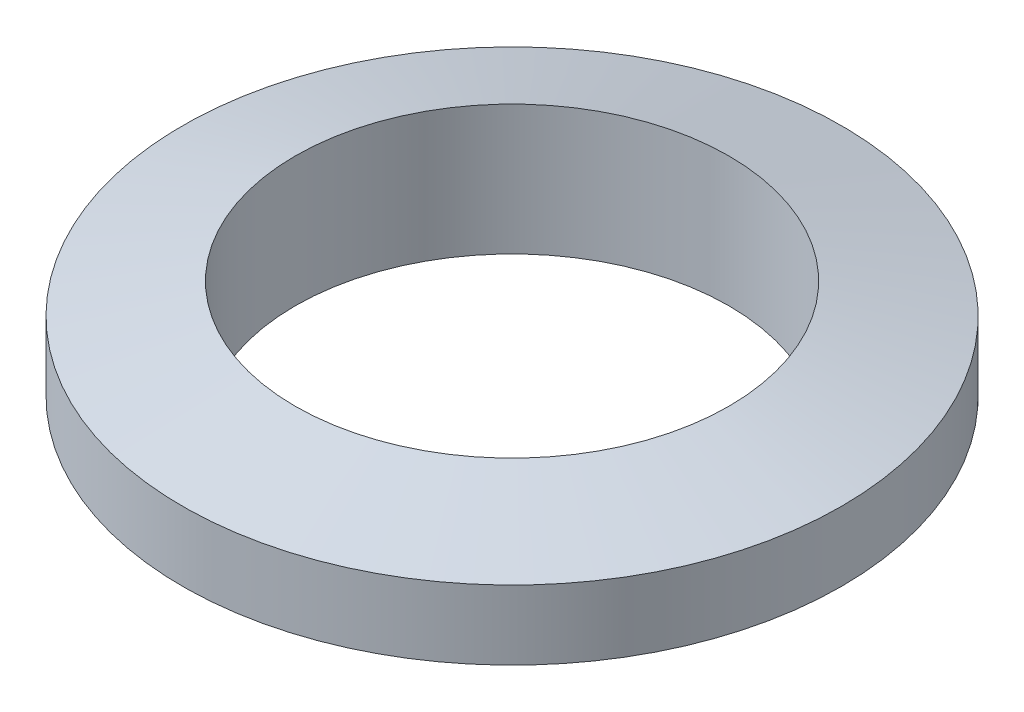
ISO-10303-21;
HEADER;
FILE_DESCRIPTION(('STEP AP214'),'2;1');
FILE_NAME('part.step','',(''),(''),'','','');
FILE_SCHEMA(('AUTOMOTIVE_DESIGN { 1 0 10303 214 1 1 1 1 }'));
ENDSEC;
DATA;
#1=APPLICATION_CONTEXT('core data for automotive mechanical design processes');
#2=APPLICATION_PROTOCOL_DEFINITION('international standard','automotive_design',2000,#1);
#3=PRODUCT_CONTEXT('',#1,'mechanical');
#4=PRODUCT('Part','Part','',(#3));
#5=PRODUCT_RELATED_PRODUCT_CATEGORY('part','',(#4));
#6=PRODUCT_DEFINITION_FORMATION('','',#4);
#7=PRODUCT_DEFINITION_CONTEXT('part definition',#1,'design');
#8=PRODUCT_DEFINITION('design','',#6,#7);
#9=PRODUCT_DEFINITION_SHAPE('','',#8);
#10=(LENGTH_UNIT() NAMED_UNIT(*) SI_UNIT(.MILLI.,.METRE.));
#11=(NAMED_UNIT(*) PLANE_ANGLE_UNIT() SI_UNIT($,.RADIAN.));
#12=(NAMED_UNIT(*) SI_UNIT($,.STERADIAN.) SOLID_ANGLE_UNIT());
#13=UNCERTAINTY_MEASURE_WITH_UNIT(LENGTH_MEASURE(1.E-05),#10,'distance_accuracy_value','');
#14=(GEOMETRIC_REPRESENTATION_CONTEXT(3) GLOBAL_UNCERTAINTY_ASSIGNED_CONTEXT((#13)) GLOBAL_UNIT_ASSIGNED_CONTEXT((#10,
#11,#12)) REPRESENTATION_CONTEXT('',''));
#15=CARTESIAN_POINT('',(0.,0.,0.));
#16=DIRECTION('',(0.,0.,1.));
#17=DIRECTION('',(1.,0.,0.));
#18=AXIS2_PLACEMENT_3D('',#15,#16,#17);
#19=CARTESIAN_POINT('',(3.49148133884313E-12,-1000.,0.));
#20=DIRECTION('',(0.,-1.,0.));
#21=DIRECTION('',(1.,0.,0.));
#22=AXIS2_PLACEMENT_3D('',#19,#20,#21);
#23=CYLINDRICAL_SURFACE('',#22,12.5);
#24=CARTESIAN_POINT('',(0.,3.74166975080215,0.));
#25=DIRECTION('',(0.,-1.,0.));
#26=DIRECTION('',(1.,0.,0.));
#27=AXIS2_PLACEMENT_3D('',#24,#25,#26);
#28=CIRCLE('',#27,12.5);
#29=CARTESIAN_POINT('',(12.5,3.74166975080219,0.));
#30=VERTEX_POINT('',#29);
#31=EDGE_CURVE('E10',#30,#30,#28,.T.);
#32=ORIENTED_EDGE('',*,*,#31,.F.);
#33=EDGE_LOOP('',(#32));
#34=FACE_BOUND('',#33,.T.);
#35=CARTESIAN_POINT('',(0.,-3.74166975080226,0.));
#36=DIRECTION('',(0.,-1.,0.));
#37=DIRECTION('',(1.,0.,0.));
#38=AXIS2_PLACEMENT_3D('',#35,#36,#37);
#39=CIRCLE('',#38,12.5);
#40=CARTESIAN_POINT('',(12.5,-3.74166975080221,0.));
#41=VERTEX_POINT('',#40);
#42=EDGE_CURVE('E45',#41,#41,#39,.T.);
#43=ORIENTED_EDGE('',*,*,#42,.T.);
#44=EDGE_LOOP('',(#43));
#45=FACE_BOUND('',#44,.T.);
#46=ADVANCED_FACE('F31',(#34,#45),#23,.F.);
#47=CARTESIAN_POINT('',(0.,3.74166975080215,0.));
#48=DIRECTION('',(0.,-1.,0.));
#49=DIRECTION('',(1.,0.,0.));
#50=AXIS2_PLACEMENT_3D('',#47,#48,#49);
#51=CONICAL_SURFACE('',#50,12.5,1.30899693899577);
#52=CARTESIAN_POINT('',(0.,2.,0.));
#53=DIRECTION('',(0.,-1.,0.));
#54=DIRECTION('',(1.,0.,0.));
#55=AXIS2_PLACEMENT_3D('',#52,#53,#54);
#56=CIRCLE('',#55,19.);
#57=CARTESIAN_POINT('',(19.,2.00000000000007,0.));
#58=VERTEX_POINT('',#57);
#59=EDGE_CURVE('E37',#58,#58,#56,.T.);
#60=ORIENTED_EDGE('',*,*,#59,.F.);
#61=EDGE_LOOP('',(#60));
#62=FACE_BOUND('',#61,.T.);
#63=ORIENTED_EDGE('',*,*,#31,.T.);
#64=EDGE_LOOP('',(#63));
#65=FACE_BOUND('',#64,.T.);
#66=ADVANCED_FACE('F60',(#62,#65),#51,.T.);
#67=CARTESIAN_POINT('',(3.49148133884313E-12,-1000.,0.));
#68=DIRECTION('',(0.,-1.,0.));
#69=DIRECTION('',(1.,0.,0.));
#70=AXIS2_PLACEMENT_3D('',#67,#68,#69);
#71=CYLINDRICAL_SURFACE('',#70,19.);
#72=CARTESIAN_POINT('',(0.,-1.99999999999989,0.));
#73=DIRECTION('',(0.,-1.,0.));
#74=DIRECTION('',(1.,0.,0.));
#75=AXIS2_PLACEMENT_3D('',#72,#73,#74);
#76=CIRCLE('',#75,19.);
#77=CARTESIAN_POINT('',(19.,-1.99999999999982,0.));
#78=VERTEX_POINT('',#77);
#79=EDGE_CURVE('E41',#78,#78,#76,.T.);
#80=ORIENTED_EDGE('',*,*,#79,.F.);
#81=EDGE_LOOP('',(#80));
#82=FACE_BOUND('',#81,.T.);
#83=ORIENTED_EDGE('',*,*,#59,.T.);
#84=EDGE_LOOP('',(#83));
#85=FACE_BOUND('',#84,.T.);
#86=ADVANCED_FACE('F55',(#82,#85),#71,.T.);
#87=CARTESIAN_POINT('',(0.,-1.99999999999989,0.));
#88=DIRECTION('',(0.,1.,0.));
#89=DIRECTION('',(-1.,0.,0.));
#90=AXIS2_PLACEMENT_3D('',#87,#88,#89);
#91=CONICAL_SURFACE('',#90,19.,1.30899693899574);
#92=ORIENTED_EDGE('',*,*,#42,.F.);
#93=EDGE_LOOP('',(#92));
#94=FACE_BOUND('',#93,.T.);
#95=ORIENTED_EDGE('',*,*,#79,.T.);
#96=EDGE_LOOP('',(#95));
#97=FACE_BOUND('',#96,.T.);
#98=ADVANCED_FACE('F52',(#94,#97),#91,.T.);
#99=CLOSED_SHELL('',(#46,#66,#86,#98));
#100=MANIFOLD_SOLID_BREP('B2',#99);
#101=ADVANCED_BREP_SHAPE_REPRESENTATION('',(#18,#100),#14);
#102=SHAPE_DEFINITION_REPRESENTATION(#9,#101);
ENDSEC;
END-ISO-10303-21;
